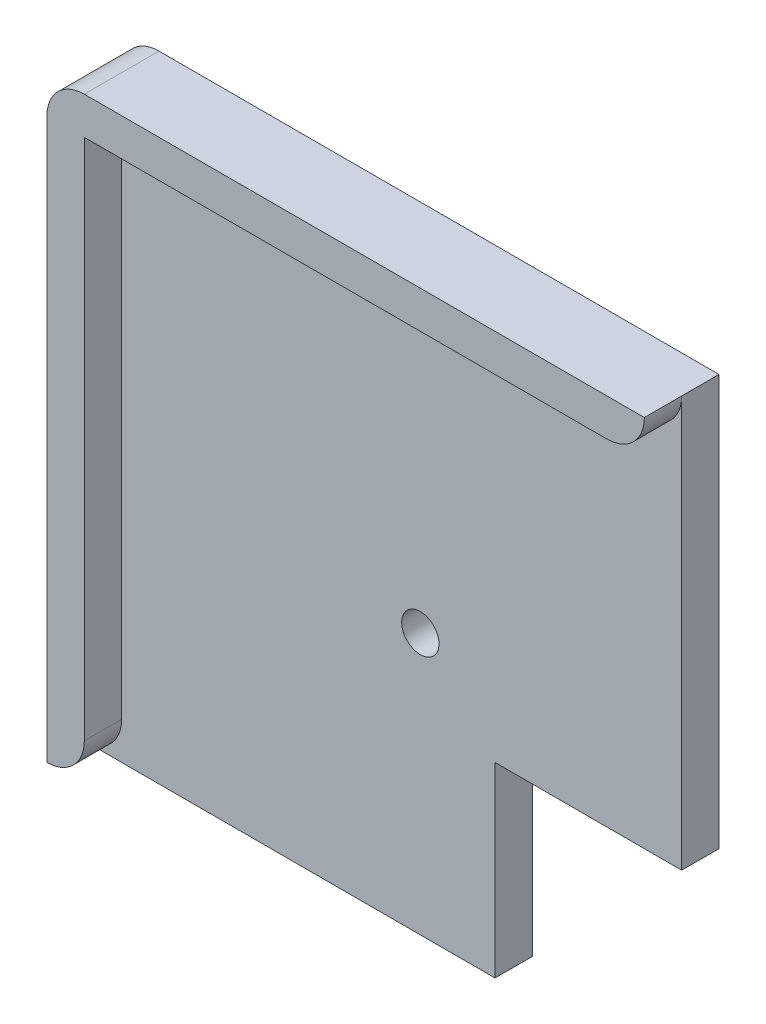
ISO-10303-21;
HEADER;
FILE_DESCRIPTION(('STEP AP214'),'2;1');
FILE_NAME('part.step','',(''),(''),'','','');
FILE_SCHEMA(('AUTOMOTIVE_DESIGN { 1 0 10303 214 1 1 1 1 }'));
ENDSEC;
DATA;
#1=APPLICATION_CONTEXT('core data for automotive mechanical design processes');
#2=APPLICATION_PROTOCOL_DEFINITION('international standard','automotive_design',2000,#1);
#3=PRODUCT_CONTEXT('',#1,'mechanical');
#4=PRODUCT('Part','Part','',(#3));
#5=PRODUCT_RELATED_PRODUCT_CATEGORY('part','',(#4));
#6=PRODUCT_DEFINITION_FORMATION('','',#4);
#7=PRODUCT_DEFINITION_CONTEXT('part definition',#1,'design');
#8=PRODUCT_DEFINITION('design','',#6,#7);
#9=PRODUCT_DEFINITION_SHAPE('','',#8);
#10=(LENGTH_UNIT() NAMED_UNIT(*) SI_UNIT(.MILLI.,.METRE.));
#11=(NAMED_UNIT(*) PLANE_ANGLE_UNIT() SI_UNIT($,.RADIAN.));
#12=(NAMED_UNIT(*) SI_UNIT($,.STERADIAN.) SOLID_ANGLE_UNIT());
#13=UNCERTAINTY_MEASURE_WITH_UNIT(LENGTH_MEASURE(1.E-05),#10,'distance_accuracy_value','');
#14=(GEOMETRIC_REPRESENTATION_CONTEXT(3) GLOBAL_UNCERTAINTY_ASSIGNED_CONTEXT((#13)) GLOBAL_UNIT_ASSIGNED_CONTEXT((#10,
#11,#12)) REPRESENTATION_CONTEXT('',''));
#15=CARTESIAN_POINT('',(0.,0.,0.));
#16=DIRECTION('',(0.,0.,1.));
#17=DIRECTION('',(1.,0.,0.));
#18=AXIS2_PLACEMENT_3D('',#15,#16,#17);
#19=CARTESIAN_POINT('',(0.,0.,2.));
#20=DIRECTION('',(0.,0.,1.));
#21=DIRECTION('',(1.,0.,0.));
#22=AXIS2_PLACEMENT_3D('',#19,#20,#21);
#23=PLANE('',#22);
#24=DIRECTION('',(1.,0.,0.));
#25=VECTOR('',#24,1.);
#26=CARTESIAN_POINT('',(-16.,-14.,2.));
#27=LINE('',#26,#25);
#28=CARTESIAN_POINT('',(-18.,-14.,2.));
#29=VERTEX_POINT('',#28);
#30=CARTESIAN_POINT('',(4.,-14.,2.));
#31=VERTEX_POINT('',#30);
#32=EDGE_CURVE('E167',#29,#31,#27,.T.);
#33=ORIENTED_EDGE('',*,*,#32,.T.);
#34=DIRECTION('',(0.,1.,0.));
#35=VECTOR('',#34,1.);
#36=CARTESIAN_POINT('',(4.,-14.,2.));
#37=LINE('',#36,#35);
#38=CARTESIAN_POINT('',(4.,-4.,2.));
#39=VERTEX_POINT('',#38);
#40=EDGE_CURVE('E170',#31,#39,#37,.T.);
#41=ORIENTED_EDGE('',*,*,#40,.T.);
#42=DIRECTION('',(1.,0.,0.));
#43=VECTOR('',#42,1.);
#44=CARTESIAN_POINT('',(4.,-4.,2.));
#45=LINE('',#44,#43);
#46=CARTESIAN_POINT('',(14.,-4.,2.));
#47=VERTEX_POINT('',#46);
#48=EDGE_CURVE('E173',#39,#47,#45,.T.);
#49=ORIENTED_EDGE('',*,*,#48,.T.);
#50=DIRECTION('',(0.,1.,0.));
#51=VECTOR('',#50,1.);
#52=CARTESIAN_POINT('',(14.,-4.,2.));
#53=LINE('',#52,#51);
#54=CARTESIAN_POINT('',(14.,18.,2.));
#55=VERTEX_POINT('',#54);
#56=EDGE_CURVE('E175',#47,#55,#53,.T.);
#57=ORIENTED_EDGE('',*,*,#56,.T.);
#58=CARTESIAN_POINT('',(12.,18.,2.));
#59=DIRECTION('',(0.,0.,1.));
#60=DIRECTION('',(1.,0.,0.));
#61=AXIS2_PLACEMENT_3D('',#58,#59,#60);
#62=CIRCLE('',#61,2.);
#63=CARTESIAN_POINT('',(12.,16.,2.));
#64=VERTEX_POINT('',#63);
#65=EDGE_CURVE('E41',#55,#64,#62,.F.);
#66=ORIENTED_EDGE('',*,*,#65,.T.);
#67=DIRECTION('',(-1.,0.,0.));
#68=VECTOR('',#67,1.);
#69=CARTESIAN_POINT('',(-16.,16.,2.));
#70=LINE('',#69,#68);
#71=CARTESIAN_POINT('',(-16.,16.,2.));
#72=VERTEX_POINT('',#71);
#73=EDGE_CURVE('E177',#64,#72,#70,.T.);
#74=ORIENTED_EDGE('',*,*,#73,.T.);
#75=DIRECTION('',(0.,-1.,0.));
#76=VECTOR('',#75,1.);
#77=CARTESIAN_POINT('',(-16.,-14.,2.));
#78=LINE('',#77,#76);
#79=CARTESIAN_POINT('',(-16.,-12.,2.));
#80=VERTEX_POINT('',#79);
#81=EDGE_CURVE('E133',#72,#80,#78,.T.);
#82=ORIENTED_EDGE('',*,*,#81,.T.);
#83=CARTESIAN_POINT('',(-18.,-12.,2.));
#84=DIRECTION('',(0.,0.,1.));
#85=DIRECTION('',(1.,0.,0.));
#86=AXIS2_PLACEMENT_3D('',#83,#84,#85);
#87=CIRCLE('',#86,2.);
#88=EDGE_CURVE('E11',#80,#29,#87,.F.);
#89=ORIENTED_EDGE('',*,*,#88,.T.);
#90=EDGE_LOOP('',(#33,#41,#49,#57,#66,#74,#82,#89));
#91=FACE_BOUND('',#90,.T.);
#92=CARTESIAN_POINT('',(0.,0.,2.));
#93=DIRECTION('',(0.,0.,1.));
#94=DIRECTION('',(1.,0.,0.));
#95=AXIS2_PLACEMENT_3D('',#92,#93,#94);
#96=CIRCLE('',#95,1.);
#97=CARTESIAN_POINT('',(1.,0.,2.));
#98=VERTEX_POINT('',#97);
#99=EDGE_CURVE('E161',#98,#98,#96,.T.);
#100=ORIENTED_EDGE('',*,*,#99,.F.);
#101=EDGE_LOOP('',(#100));
#102=FACE_BOUND('',#101,.T.);
#103=ADVANCED_FACE('F33',(#91,#102),#23,.T.);
#104=CARTESIAN_POINT('',(0.,0.,0.));
#105=DIRECTION('',(0.,0.,1.));
#106=DIRECTION('',(1.,0.,0.));
#107=AXIS2_PLACEMENT_3D('',#104,#105,#106);
#108=PLANE('',#107);
#109=DIRECTION('',(0.,-1.,0.));
#110=VECTOR('',#109,1.);
#111=CARTESIAN_POINT('',(-18.,18.,0.));
#112=LINE('',#111,#110);
#113=CARTESIAN_POINT('',(-18.,16.,0.));
#114=VERTEX_POINT('',#113);
#115=CARTESIAN_POINT('',(-18.,-14.,0.));
#116=VERTEX_POINT('',#115);
#117=EDGE_CURVE('E137',#114,#116,#112,.T.);
#118=ORIENTED_EDGE('',*,*,#117,.F.);
#119=CARTESIAN_POINT('',(-16.,16.,0.));
#120=DIRECTION('',(0.,0.,1.));
#121=DIRECTION('',(1.,0.,0.));
#122=AXIS2_PLACEMENT_3D('',#119,#120,#121);
#123=CIRCLE('',#122,2.);
#124=CARTESIAN_POINT('',(-16.,18.,0.));
#125=VERTEX_POINT('',#124);
#126=EDGE_CURVE('E55',#114,#125,#123,.F.);
#127=ORIENTED_EDGE('',*,*,#126,.T.);
#128=DIRECTION('',(-1.,0.,0.));
#129=VECTOR('',#128,1.);
#130=CARTESIAN_POINT('',(14.,18.,0.));
#131=LINE('',#130,#129);
#132=CARTESIAN_POINT('',(14.,18.,0.));
#133=VERTEX_POINT('',#132);
#134=EDGE_CURVE('E150',#133,#125,#131,.T.);
#135=ORIENTED_EDGE('',*,*,#134,.F.);
#136=DIRECTION('',(0.,1.,0.));
#137=VECTOR('',#136,1.);
#138=CARTESIAN_POINT('',(14.,-4.,0.));
#139=LINE('',#138,#137);
#140=CARTESIAN_POINT('',(14.,-4.,0.));
#141=VERTEX_POINT('',#140);
#142=EDGE_CURVE('E171',#141,#133,#139,.T.);
#143=ORIENTED_EDGE('',*,*,#142,.F.);
#144=DIRECTION('',(1.,0.,0.));
#145=VECTOR('',#144,1.);
#146=CARTESIAN_POINT('',(4.,-4.,0.));
#147=LINE('',#146,#145);
#148=CARTESIAN_POINT('',(4.,-4.,0.));
#149=VERTEX_POINT('',#148);
#150=EDGE_CURVE('E185',#149,#141,#147,.T.);
#151=ORIENTED_EDGE('',*,*,#150,.F.);
#152=DIRECTION('',(0.,1.,0.));
#153=VECTOR('',#152,1.);
#154=CARTESIAN_POINT('',(4.,-14.,0.));
#155=LINE('',#154,#153);
#156=CARTESIAN_POINT('',(4.,-14.,0.));
#157=VERTEX_POINT('',#156);
#158=EDGE_CURVE('E183',#157,#149,#155,.T.);
#159=ORIENTED_EDGE('',*,*,#158,.F.);
#160=DIRECTION('',(1.,0.,0.));
#161=VECTOR('',#160,1.);
#162=CARTESIAN_POINT('',(-16.,-14.,0.));
#163=LINE('',#162,#161);
#164=EDGE_CURVE('E164',#116,#157,#163,.T.);
#165=ORIENTED_EDGE('',*,*,#164,.F.);
#166=EDGE_LOOP('',(#118,#127,#135,#143,#151,#159,#165));
#167=FACE_BOUND('',#166,.T.);
#168=CARTESIAN_POINT('',(0.,0.,0.));
#169=DIRECTION('',(0.,0.,1.));
#170=DIRECTION('',(1.,0.,0.));
#171=AXIS2_PLACEMENT_3D('',#168,#169,#170);
#172=CIRCLE('',#171,1.);
#173=CARTESIAN_POINT('',(1.,0.,0.));
#174=VERTEX_POINT('',#173);
#175=EDGE_CURVE('E156',#174,#174,#172,.T.);
#176=ORIENTED_EDGE('',*,*,#175,.T.);
#177=EDGE_LOOP('',(#176));
#178=FACE_BOUND('',#177,.T.);
#179=ADVANCED_FACE('F244',(#167,#178),#108,.F.);
#180=CARTESIAN_POINT('',(-16.,-14.,2.));
#181=DIRECTION('',(0.,1.,0.));
#182=DIRECTION('',(-1.,0.,0.));
#183=AXIS2_PLACEMENT_3D('',#180,#181,#182);
#184=PLANE('',#183);
#185=ORIENTED_EDGE('',*,*,#32,.F.);
#186=DIRECTION('',(0.,0.,1.));
#187=VECTOR('',#186,1.);
#188=CARTESIAN_POINT('',(-18.,-14.,0.));
#189=LINE('',#188,#187);
#190=EDGE_CURVE('E153',#116,#29,#189,.T.);
#191=ORIENTED_EDGE('',*,*,#190,.F.);
#192=ORIENTED_EDGE('',*,*,#164,.T.);
#193=DIRECTION('',(0.,0.,-1.));
#194=VECTOR('',#193,1.);
#195=CARTESIAN_POINT('',(4.,-14.,2.));
#196=LINE('',#195,#194);
#197=EDGE_CURVE('E193',#31,#157,#196,.T.);
#198=ORIENTED_EDGE('',*,*,#197,.F.);
#199=EDGE_LOOP('',(#185,#191,#192,#198));
#200=FACE_BOUND('',#199,.T.);
#201=ADVANCED_FACE('F232',(#200),#184,.F.);
#202=CARTESIAN_POINT('',(4.,-14.,2.));
#203=DIRECTION('',(-1.,0.,0.));
#204=DIRECTION('',(0.,0.,1.));
#205=AXIS2_PLACEMENT_3D('',#202,#203,#204);
#206=PLANE('',#205);
#207=ORIENTED_EDGE('',*,*,#158,.T.);
#208=DIRECTION('',(0.,0.,-1.));
#209=VECTOR('',#208,1.);
#210=CARTESIAN_POINT('',(4.,-4.,2.));
#211=LINE('',#210,#209);
#212=EDGE_CURVE('E190',#39,#149,#211,.T.);
#213=ORIENTED_EDGE('',*,*,#212,.F.);
#214=ORIENTED_EDGE('',*,*,#40,.F.);
#215=ORIENTED_EDGE('',*,*,#197,.T.);
#216=EDGE_LOOP('',(#207,#213,#214,#215));
#217=FACE_BOUND('',#216,.T.);
#218=ADVANCED_FACE('F235',(#217),#206,.F.);
#219=CARTESIAN_POINT('',(4.,-4.,2.));
#220=DIRECTION('',(0.,1.,0.));
#221=DIRECTION('',(-1.,0.,0.));
#222=AXIS2_PLACEMENT_3D('',#219,#220,#221);
#223=PLANE('',#222);
#224=ORIENTED_EDGE('',*,*,#150,.T.);
#225=DIRECTION('',(0.,0.,-1.));
#226=VECTOR('',#225,1.);
#227=CARTESIAN_POINT('',(14.,-4.,2.));
#228=LINE('',#227,#226);
#229=EDGE_CURVE('E180',#47,#141,#228,.T.);
#230=ORIENTED_EDGE('',*,*,#229,.F.);
#231=ORIENTED_EDGE('',*,*,#48,.F.);
#232=ORIENTED_EDGE('',*,*,#212,.T.);
#233=EDGE_LOOP('',(#224,#230,#231,#232));
#234=FACE_BOUND('',#233,.T.);
#235=ADVANCED_FACE('F240',(#234),#223,.F.);
#236=CARTESIAN_POINT('',(14.,-4.,2.));
#237=DIRECTION('',(-1.,0.,0.));
#238=DIRECTION('',(0.,-1.,0.));
#239=AXIS2_PLACEMENT_3D('',#236,#237,#238);
#240=PLANE('',#239);
#241=DIRECTION('',(0.,0.,1.));
#242=VECTOR('',#241,1.);
#243=CARTESIAN_POINT('',(14.,18.,0.));
#244=LINE('',#243,#242);
#245=EDGE_CURVE('E158',#133,#55,#244,.T.);
#246=ORIENTED_EDGE('',*,*,#245,.T.);
#247=ORIENTED_EDGE('',*,*,#56,.F.);
#248=ORIENTED_EDGE('',*,*,#229,.T.);
#249=ORIENTED_EDGE('',*,*,#142,.T.);
#250=EDGE_LOOP('',(#246,#247,#248,#249));
#251=FACE_BOUND('',#250,.T.);
#252=ADVANCED_FACE('F243',(#251),#240,.F.);
#253=CARTESIAN_POINT('',(0.,0.,2.));
#254=DIRECTION('',(0.,0.,-1.));
#255=DIRECTION('',(-1.,0.,0.));
#256=AXIS2_PLACEMENT_3D('',#253,#254,#255);
#257=CYLINDRICAL_SURFACE('',#256,1.);
#258=ORIENTED_EDGE('',*,*,#99,.T.);
#259=EDGE_LOOP('',(#258));
#260=FACE_BOUND('',#259,.T.);
#261=ORIENTED_EDGE('',*,*,#175,.F.);
#262=EDGE_LOOP('',(#261));
#263=FACE_BOUND('',#262,.T.);
#264=ADVANCED_FACE('F250',(#260,#263),#257,.F.);
#265=CARTESIAN_POINT('',(-16.,-14.,0.));
#266=DIRECTION('',(1.,0.,0.));
#267=DIRECTION('',(0.,0.,-1.));
#268=AXIS2_PLACEMENT_3D('',#265,#266,#267);
#269=PLANE('',#268);
#270=DIRECTION('',(0.,1.,0.));
#271=VECTOR('',#270,1.);
#272=CARTESIAN_POINT('',(-16.,-14.,4.));
#273=LINE('',#272,#271);
#274=CARTESIAN_POINT('',(-16.,-12.,4.));
#275=VERTEX_POINT('',#274);
#276=CARTESIAN_POINT('',(-16.,16.,4.));
#277=VERTEX_POINT('',#276);
#278=EDGE_CURVE('E118',#275,#277,#273,.T.);
#279=ORIENTED_EDGE('',*,*,#278,.F.);
#280=DIRECTION('',(0.,0.,1.));
#281=VECTOR('',#280,1.);
#282=CARTESIAN_POINT('',(-16.,-12.,2.));
#283=LINE('',#282,#281);
#284=EDGE_CURVE('E202',#275,#80,#283,.F.);
#285=ORIENTED_EDGE('',*,*,#284,.T.);
#286=ORIENTED_EDGE('',*,*,#81,.F.);
#287=DIRECTION('',(0.,0.,1.));
#288=VECTOR('',#287,1.);
#289=CARTESIAN_POINT('',(-16.,16.,0.));
#290=LINE('',#289,#288);
#291=EDGE_CURVE('E130',#72,#277,#290,.T.);
#292=ORIENTED_EDGE('',*,*,#291,.T.);
#293=EDGE_LOOP('',(#279,#285,#286,#292));
#294=FACE_BOUND('',#293,.T.);
#295=ADVANCED_FACE('F131',(#294),#269,.T.);
#296=CARTESIAN_POINT('',(-18.,18.,0.));
#297=DIRECTION('',(-1.,0.,0.));
#298=DIRECTION('',(0.,0.,1.));
#299=AXIS2_PLACEMENT_3D('',#296,#297,#298);
#300=PLANE('',#299);
#301=DIRECTION('',(0.,-1.,0.));
#302=VECTOR('',#301,1.);
#303=CARTESIAN_POINT('',(-18.,18.,4.));
#304=LINE('',#303,#302);
#305=CARTESIAN_POINT('',(-18.,16.,4.));
#306=VERTEX_POINT('',#305);
#307=CARTESIAN_POINT('',(-18.,-14.,4.));
#308=VERTEX_POINT('',#307);
#309=EDGE_CURVE('E146',#306,#308,#304,.T.);
#310=ORIENTED_EDGE('',*,*,#309,.F.);
#311=DIRECTION('',(0.,0.,1.));
#312=VECTOR('',#311,1.);
#313=CARTESIAN_POINT('',(-18.,16.,0.));
#314=LINE('',#313,#312);
#315=EDGE_CURVE('E48',#306,#114,#314,.F.);
#316=ORIENTED_EDGE('',*,*,#315,.T.);
#317=ORIENTED_EDGE('',*,*,#117,.T.);
#318=ORIENTED_EDGE('',*,*,#190,.T.);
#319=EDGE_CURVE('E157',#29,#308,#189,.T.);
#320=ORIENTED_EDGE('',*,*,#319,.T.);
#321=EDGE_LOOP('',(#310,#316,#317,#318,#320));
#322=FACE_BOUND('',#321,.T.);
#323=ADVANCED_FACE('F223',(#322),#300,.T.);
#324=CARTESIAN_POINT('',(14.,18.,0.));
#325=DIRECTION('',(0.,1.,0.));
#326=DIRECTION('',(0.,0.,1.));
#327=AXIS2_PLACEMENT_3D('',#324,#325,#326);
#328=PLANE('',#327);
#329=ORIENTED_EDGE('',*,*,#134,.T.);
#330=DIRECTION('',(0.,0.,1.));
#331=VECTOR('',#330,1.);
#332=CARTESIAN_POINT('',(-16.,18.,0.));
#333=LINE('',#332,#331);
#334=CARTESIAN_POINT('',(-16.,18.,4.));
#335=VERTEX_POINT('',#334);
#336=EDGE_CURVE('E204',#125,#335,#333,.T.);
#337=ORIENTED_EDGE('',*,*,#336,.T.);
#338=DIRECTION('',(-1.,0.,0.));
#339=VECTOR('',#338,1.);
#340=CARTESIAN_POINT('',(14.,18.,4.));
#341=LINE('',#340,#339);
#342=CARTESIAN_POINT('',(14.,18.,4.));
#343=VERTEX_POINT('',#342);
#344=EDGE_CURVE('E143',#343,#335,#341,.T.);
#345=ORIENTED_EDGE('',*,*,#344,.F.);
#346=EDGE_CURVE('E136',#55,#343,#244,.T.);
#347=ORIENTED_EDGE('',*,*,#346,.F.);
#348=ORIENTED_EDGE('',*,*,#245,.F.);
#349=EDGE_LOOP('',(#329,#337,#345,#347,#348));
#350=FACE_BOUND('',#349,.T.);
#351=ADVANCED_FACE('F218',(#350),#328,.T.);
#352=CARTESIAN_POINT('',(-16.,16.,0.));
#353=DIRECTION('',(0.,-1.,0.));
#354=DIRECTION('',(0.,0.,-1.));
#355=AXIS2_PLACEMENT_3D('',#352,#353,#354);
#356=PLANE('',#355);
#357=ORIENTED_EDGE('',*,*,#73,.F.);
#358=DIRECTION('',(0.,0.,1.));
#359=VECTOR('',#358,1.);
#360=CARTESIAN_POINT('',(12.,16.,4.));
#361=LINE('',#360,#359);
#362=CARTESIAN_POINT('',(12.,16.,4.));
#363=VERTEX_POINT('',#362);
#364=EDGE_CURVE('E142',#64,#363,#361,.T.);
#365=ORIENTED_EDGE('',*,*,#364,.T.);
#366=DIRECTION('',(1.,0.,0.));
#367=VECTOR('',#366,1.);
#368=CARTESIAN_POINT('',(-16.,16.,4.));
#369=LINE('',#368,#367);
#370=EDGE_CURVE('E122',#277,#363,#369,.T.);
#371=ORIENTED_EDGE('',*,*,#370,.F.);
#372=ORIENTED_EDGE('',*,*,#291,.F.);
#373=EDGE_LOOP('',(#357,#365,#371,#372));
#374=FACE_BOUND('',#373,.T.);
#375=ADVANCED_FACE('F140',(#374),#356,.T.);
#376=CARTESIAN_POINT('',(0.,0.,4.));
#377=DIRECTION('',(0.,0.,-1.));
#378=DIRECTION('',(-1.,0.,0.));
#379=AXIS2_PLACEMENT_3D('',#376,#377,#378);
#380=PLANE('',#379);
#381=ORIENTED_EDGE('',*,*,#370,.T.);
#382=CARTESIAN_POINT('',(12.,18.,4.));
#383=DIRECTION('',(0.,0.,-1.));
#384=DIRECTION('',(-1.,0.,0.));
#385=AXIS2_PLACEMENT_3D('',#382,#383,#384);
#386=CIRCLE('',#385,2.);
#387=EDGE_CURVE('E200',#363,#343,#386,.F.);
#388=ORIENTED_EDGE('',*,*,#387,.T.);
#389=ORIENTED_EDGE('',*,*,#344,.T.);
#390=CARTESIAN_POINT('',(-16.,16.,4.));
#391=DIRECTION('',(0.,0.,-1.));
#392=DIRECTION('',(-1.,0.,0.));
#393=AXIS2_PLACEMENT_3D('',#390,#391,#392);
#394=CIRCLE('',#393,2.);
#395=EDGE_CURVE('E197',#335,#306,#394,.F.);
#396=ORIENTED_EDGE('',*,*,#395,.T.);
#397=ORIENTED_EDGE('',*,*,#309,.T.);
#398=CARTESIAN_POINT('',(-18.,-12.,4.));
#399=DIRECTION('',(0.,0.,-1.));
#400=DIRECTION('',(-1.,0.,0.));
#401=AXIS2_PLACEMENT_3D('',#398,#399,#400);
#402=CIRCLE('',#401,2.);
#403=EDGE_CURVE('E124',#308,#275,#402,.F.);
#404=ORIENTED_EDGE('',*,*,#403,.T.);
#405=ORIENTED_EDGE('',*,*,#278,.T.);
#406=EDGE_LOOP('',(#381,#388,#389,#396,#397,#404,#405));
#407=FACE_BOUND('',#406,.T.);
#408=ADVANCED_FACE('F120',(#407),#380,.F.);
#409=CARTESIAN_POINT('',(12.,18.,0.));
#410=DIRECTION('',(0.,0.,-1.));
#411=DIRECTION('',(-1.,0.,0.));
#412=AXIS2_PLACEMENT_3D('',#409,#410,#411);
#413=CYLINDRICAL_SURFACE('',#412,2.);
#414=ORIENTED_EDGE('',*,*,#65,.F.);
#415=ORIENTED_EDGE('',*,*,#346,.T.);
#416=ORIENTED_EDGE('',*,*,#387,.F.);
#417=ORIENTED_EDGE('',*,*,#364,.F.);
#418=EDGE_LOOP('',(#414,#415,#416,#417));
#419=FACE_BOUND('',#418,.T.);
#420=ADVANCED_FACE('F215',(#419),#413,.T.);
#421=CARTESIAN_POINT('',(-18.,-12.,2.));
#422=DIRECTION('',(0.,0.,-1.));
#423=DIRECTION('',(-1.,0.,0.));
#424=AXIS2_PLACEMENT_3D('',#421,#422,#423);
#425=CYLINDRICAL_SURFACE('',#424,2.);
#426=ORIENTED_EDGE('',*,*,#88,.F.);
#427=ORIENTED_EDGE('',*,*,#284,.F.);
#428=ORIENTED_EDGE('',*,*,#403,.F.);
#429=ORIENTED_EDGE('',*,*,#319,.F.);
#430=EDGE_LOOP('',(#426,#427,#428,#429));
#431=FACE_BOUND('',#430,.T.);
#432=ADVANCED_FACE('F228',(#431),#425,.T.);
#433=CARTESIAN_POINT('',(-16.,16.,0.));
#434=DIRECTION('',(0.,0.,1.));
#435=DIRECTION('',(1.,0.,0.));
#436=AXIS2_PLACEMENT_3D('',#433,#434,#435);
#437=CYLINDRICAL_SURFACE('',#436,2.);
#438=ORIENTED_EDGE('',*,*,#126,.F.);
#439=ORIENTED_EDGE('',*,*,#315,.F.);
#440=ORIENTED_EDGE('',*,*,#395,.F.);
#441=ORIENTED_EDGE('',*,*,#336,.F.);
#442=EDGE_LOOP('',(#438,#439,#440,#441));
#443=FACE_BOUND('',#442,.T.);
#444=ADVANCED_FACE('F35',(#443),#437,.T.);
#445=CLOSED_SHELL('',(#103,#179,#201,#218,#235,#252,#264,#295,#323,#351,#375,#408,#420,#432,#444));
#446=MANIFOLD_SOLID_BREP('B2',#445);
#447=ADVANCED_BREP_SHAPE_REPRESENTATION('',(#18,#446),#14);
#448=SHAPE_DEFINITION_REPRESENTATION(#9,#447);
ENDSEC;
END-ISO-10303-21;
